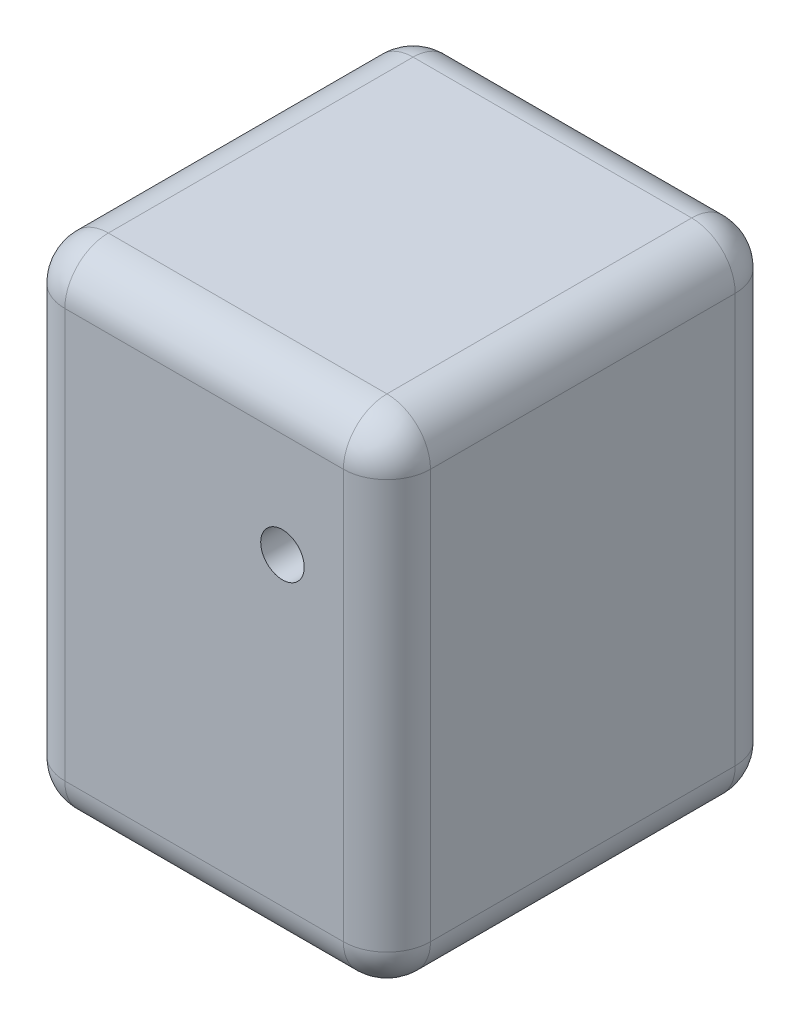
ISO-10303-21;
HEADER;
FILE_DESCRIPTION(('STEP AP214'),'2;1');
FILE_NAME('part.step','',(''),(''),'','','');
FILE_SCHEMA(('AUTOMOTIVE_DESIGN { 1 0 10303 214 1 1 1 1 }'));
ENDSEC;
DATA;
#1=APPLICATION_CONTEXT('core data for automotive mechanical design processes');
#2=APPLICATION_PROTOCOL_DEFINITION('international standard','automotive_design',2000,#1);
#3=PRODUCT_CONTEXT('',#1,'mechanical');
#4=PRODUCT('Part','Part','',(#3));
#5=PRODUCT_RELATED_PRODUCT_CATEGORY('part','',(#4));
#6=PRODUCT_DEFINITION_FORMATION('','',#4);
#7=PRODUCT_DEFINITION_CONTEXT('part definition',#1,'design');
#8=PRODUCT_DEFINITION('design','',#6,#7);
#9=PRODUCT_DEFINITION_SHAPE('','',#8);
#10=(LENGTH_UNIT() NAMED_UNIT(*) SI_UNIT(.MILLI.,.METRE.));
#11=(NAMED_UNIT(*) PLANE_ANGLE_UNIT() SI_UNIT($,.RADIAN.));
#12=(NAMED_UNIT(*) SI_UNIT($,.STERADIAN.) SOLID_ANGLE_UNIT());
#13=UNCERTAINTY_MEASURE_WITH_UNIT(LENGTH_MEASURE(1.E-05),#10,'distance_accuracy_value','');
#14=(GEOMETRIC_REPRESENTATION_CONTEXT(3) GLOBAL_UNCERTAINTY_ASSIGNED_CONTEXT((#13)) GLOBAL_UNIT_ASSIGNED_CONTEXT((#10,
#11,#12)) REPRESENTATION_CONTEXT('',''));
#15=CARTESIAN_POINT('',(0.,0.,0.));
#16=DIRECTION('',(0.,0.,1.));
#17=DIRECTION('',(1.,0.,0.));
#18=AXIS2_PLACEMENT_3D('',#15,#16,#17);
#19=CARTESIAN_POINT('',(0.,0.,45.));
#20=DIRECTION('',(0.,0.,1.));
#21=DIRECTION('',(1.,0.,0.));
#22=AXIS2_PLACEMENT_3D('',#19,#20,#21);
#23=PLANE('',#22);
#24=DIRECTION('',(-1.,0.,0.));
#25=VECTOR('',#24,1.);
#26=CARTESIAN_POINT('',(-30.,12.,45.));
#27=LINE('',#26,#25);
#28=CARTESIAN_POINT('',(7.,12.,45.));
#29=VERTEX_POINT('',#28);
#30=CARTESIAN_POINT('',(-25.,12.,45.));
#31=VERTEX_POINT('',#30);
#32=EDGE_CURVE('E204',#29,#31,#27,.T.);
#33=ORIENTED_EDGE('',*,*,#32,.T.);
#34=DIRECTION('',(0.,-1.,0.));
#35=VECTOR('',#34,1.);
#36=CARTESIAN_POINT('',(-25.,-40.,45.));
#37=LINE('',#36,#35);
#38=CARTESIAN_POINT('',(-25.,-35.,45.));
#39=VERTEX_POINT('',#38);
#40=EDGE_CURVE('E207',#31,#39,#37,.T.);
#41=ORIENTED_EDGE('',*,*,#40,.T.);
#42=DIRECTION('',(1.,0.,0.));
#43=VECTOR('',#42,1.);
#44=CARTESIAN_POINT('',(12.,-35.,45.));
#45=LINE('',#44,#43);
#46=CARTESIAN_POINT('',(7.,-35.,45.));
#47=VERTEX_POINT('',#46);
#48=EDGE_CURVE('E202',#39,#47,#45,.T.);
#49=ORIENTED_EDGE('',*,*,#48,.T.);
#50=DIRECTION('',(0.,1.,0.));
#51=VECTOR('',#50,1.);
#52=CARTESIAN_POINT('',(7.,17.,45.));
#53=LINE('',#52,#51);
#54=EDGE_CURVE('E200',#47,#29,#53,.T.);
#55=ORIENTED_EDGE('',*,*,#54,.T.);
#56=EDGE_LOOP('',(#33,#41,#49,#55));
#57=FACE_BOUND('',#56,.T.);
#58=CARTESIAN_POINT('',(0.,0.,45.));
#59=DIRECTION('',(0.,0.,1.));
#60=DIRECTION('',(1.,0.,0.));
#61=AXIS2_PLACEMENT_3D('',#58,#59,#60);
#62=CIRCLE('',#61,2.5);
#63=CARTESIAN_POINT('',(-2.5,0.,45.));
#64=VERTEX_POINT('',#63);
#65=EDGE_CURVE('E171',#64,#64,#62,.T.);
#66=ORIENTED_EDGE('',*,*,#65,.F.);
#67=EDGE_LOOP('',(#66));
#68=FACE_BOUND('',#67,.T.);
#69=ADVANCED_FACE('F44',(#57,#68),#23,.T.);
#70=CARTESIAN_POINT('',(0.,0.,0.));
#71=DIRECTION('',(0.,0.,1.));
#72=DIRECTION('',(1.,0.,0.));
#73=AXIS2_PLACEMENT_3D('',#70,#71,#72);
#74=PLANE('',#73);
#75=DIRECTION('',(0.,1.,0.));
#76=VECTOR('',#75,1.);
#77=CARTESIAN_POINT('',(7.,0.,0.));
#78=LINE('',#77,#76);
#79=CARTESIAN_POINT('',(7.,12.,0.));
#80=VERTEX_POINT('',#79);
#81=CARTESIAN_POINT('',(7.,-35.,0.));
#82=VERTEX_POINT('',#81);
#83=EDGE_CURVE('E196',#80,#82,#78,.F.);
#84=ORIENTED_EDGE('',*,*,#83,.T.);
#85=DIRECTION('',(1.,0.,0.));
#86=VECTOR('',#85,1.);
#87=CARTESIAN_POINT('',(0.,-35.,0.));
#88=LINE('',#87,#86);
#89=CARTESIAN_POINT('',(-25.,-35.,0.));
#90=VERTEX_POINT('',#89);
#91=EDGE_CURVE('E267',#82,#90,#88,.F.);
#92=ORIENTED_EDGE('',*,*,#91,.T.);
#93=DIRECTION('',(0.,-1.,0.));
#94=VECTOR('',#93,1.);
#95=CARTESIAN_POINT('',(-25.,0.,0.));
#96=LINE('',#95,#94);
#97=CARTESIAN_POINT('',(-25.,12.,0.));
#98=VERTEX_POINT('',#97);
#99=EDGE_CURVE('E198',#90,#98,#96,.F.);
#100=ORIENTED_EDGE('',*,*,#99,.T.);
#101=DIRECTION('',(-1.,0.,0.));
#102=VECTOR('',#101,1.);
#103=CARTESIAN_POINT('',(0.,12.,0.));
#104=LINE('',#103,#102);
#105=EDGE_CURVE('E194',#98,#80,#104,.F.);
#106=ORIENTED_EDGE('',*,*,#105,.T.);
#107=EDGE_LOOP('',(#84,#92,#100,#106));
#108=FACE_BOUND('',#107,.T.);
#109=CARTESIAN_POINT('',(0.,0.,0.));
#110=DIRECTION('',(0.,0.,1.));
#111=DIRECTION('',(1.,0.,0.));
#112=AXIS2_PLACEMENT_3D('',#109,#110,#111);
#113=CIRCLE('',#112,2.5);
#114=CARTESIAN_POINT('',(-2.5,0.,0.));
#115=VERTEX_POINT('',#114);
#116=EDGE_CURVE('E174',#115,#115,#113,.T.);
#117=ORIENTED_EDGE('',*,*,#116,.T.);
#118=EDGE_LOOP('',(#117));
#119=FACE_BOUND('',#118,.T.);
#120=ADVANCED_FACE('F281',(#108,#119),#74,.F.);
#121=CARTESIAN_POINT('',(-30.,17.,45.));
#122=DIRECTION('',(1.,0.,0.));
#123=DIRECTION('',(0.,0.,-1.));
#124=AXIS2_PLACEMENT_3D('',#121,#122,#123);
#125=PLANE('',#124);
#126=CARTESIAN_POINT('',(-30.,-11.5,22.5));
#127=DIRECTION('',(1.,0.,0.));
#128=DIRECTION('',(0.,0.,-1.));
#129=AXIS2_PLACEMENT_3D('',#126,#127,#128);
#130=CIRCLE('',#129,10.);
#131=CARTESIAN_POINT('',(-30.,-11.5,12.5));
#132=VERTEX_POINT('',#131);
#133=EDGE_CURVE('E52',#132,#132,#130,.F.);
#134=ORIENTED_EDGE('',*,*,#133,.F.);
#135=EDGE_LOOP('',(#134));
#136=FACE_BOUND('',#135,.T.);
#137=DIRECTION('',(0.,0.,-1.));
#138=VECTOR('',#137,1.);
#139=CARTESIAN_POINT('',(-30.,12.,45.));
#140=LINE('',#139,#138);
#141=CARTESIAN_POINT('',(-30.,12.,40.));
#142=VERTEX_POINT('',#141);
#143=CARTESIAN_POINT('',(-30.,12.,5.));
#144=VERTEX_POINT('',#143);
#145=EDGE_CURVE('E146',#142,#144,#140,.T.);
#146=ORIENTED_EDGE('',*,*,#145,.T.);
#147=DIRECTION('',(0.,-1.,0.));
#148=VECTOR('',#147,1.);
#149=CARTESIAN_POINT('',(-30.,17.,5.));
#150=LINE('',#149,#148);
#151=CARTESIAN_POINT('',(-30.,-35.,5.));
#152=VERTEX_POINT('',#151);
#153=EDGE_CURVE('E144',#144,#152,#150,.T.);
#154=ORIENTED_EDGE('',*,*,#153,.T.);
#155=DIRECTION('',(0.,0.,-1.));
#156=VECTOR('',#155,1.);
#157=CARTESIAN_POINT('',(-30.,-35.,45.));
#158=LINE('',#157,#156);
#159=CARTESIAN_POINT('',(-30.,-35.,40.));
#160=VERTEX_POINT('',#159);
#161=EDGE_CURVE('E136',#152,#160,#158,.F.);
#162=ORIENTED_EDGE('',*,*,#161,.T.);
#163=DIRECTION('',(0.,-1.,0.));
#164=VECTOR('',#163,1.);
#165=CARTESIAN_POINT('',(-30.,17.,40.));
#166=LINE('',#165,#164);
#167=EDGE_CURVE('E141',#160,#142,#166,.F.);
#168=ORIENTED_EDGE('',*,*,#167,.T.);
#169=EDGE_LOOP('',(#146,#154,#162,#168));
#170=FACE_BOUND('',#169,.T.);
#171=ADVANCED_FACE('F139',(#136,#170),#125,.F.);
#172=CARTESIAN_POINT('',(-30.,-40.,45.));
#173=DIRECTION('',(0.,1.,0.));
#174=DIRECTION('',(-1.,0.,0.));
#175=AXIS2_PLACEMENT_3D('',#172,#173,#174);
#176=PLANE('',#175);
#177=DIRECTION('',(0.,0.,-1.));
#178=VECTOR('',#177,1.);
#179=CARTESIAN_POINT('',(-25.,-40.,45.));
#180=LINE('',#179,#178);
#181=CARTESIAN_POINT('',(-25.,-40.,40.));
#182=VERTEX_POINT('',#181);
#183=CARTESIAN_POINT('',(-25.,-40.,5.));
#184=VERTEX_POINT('',#183);
#185=EDGE_CURVE('E153',#182,#184,#180,.T.);
#186=ORIENTED_EDGE('',*,*,#185,.T.);
#187=DIRECTION('',(1.,0.,0.));
#188=VECTOR('',#187,1.);
#189=CARTESIAN_POINT('',(-30.,-40.,5.));
#190=LINE('',#189,#188);
#191=CARTESIAN_POINT('',(7.00000000000001,-40.,5.));
#192=VERTEX_POINT('',#191);
#193=EDGE_CURVE('E59',#184,#192,#190,.T.);
#194=ORIENTED_EDGE('',*,*,#193,.T.);
#195=DIRECTION('',(0.,0.,-1.));
#196=VECTOR('',#195,1.);
#197=CARTESIAN_POINT('',(7.00000000000001,-40.,45.));
#198=LINE('',#197,#196);
#199=CARTESIAN_POINT('',(7.00000000000001,-40.,40.));
#200=VERTEX_POINT('',#199);
#201=EDGE_CURVE('E189',#192,#200,#198,.F.);
#202=ORIENTED_EDGE('',*,*,#201,.T.);
#203=DIRECTION('',(1.,0.,0.));
#204=VECTOR('',#203,1.);
#205=CARTESIAN_POINT('',(-30.,-40.,40.));
#206=LINE('',#205,#204);
#207=EDGE_CURVE('E191',#200,#182,#206,.F.);
#208=ORIENTED_EDGE('',*,*,#207,.T.);
#209=EDGE_LOOP('',(#186,#194,#202,#208));
#210=FACE_BOUND('',#209,.T.);
#211=ADVANCED_FACE('F280',(#210),#176,.F.);
#212=CARTESIAN_POINT('',(12.,17.,45.));
#213=DIRECTION('',(-1.,0.,0.));
#214=DIRECTION('',(0.,0.,1.));
#215=AXIS2_PLACEMENT_3D('',#212,#213,#214);
#216=PLANE('',#215);
#217=DIRECTION('',(0.,1.,0.));
#218=VECTOR('',#217,1.);
#219=CARTESIAN_POINT('',(12.,-40.,40.));
#220=LINE('',#219,#218);
#221=CARTESIAN_POINT('',(12.,12.,40.));
#222=VERTEX_POINT('',#221);
#223=CARTESIAN_POINT('',(12.,-35.,40.));
#224=VERTEX_POINT('',#223);
#225=EDGE_CURVE('E213',#222,#224,#220,.F.);
#226=ORIENTED_EDGE('',*,*,#225,.T.);
#227=DIRECTION('',(0.,0.,-1.));
#228=VECTOR('',#227,1.);
#229=CARTESIAN_POINT('',(12.,-35.,45.));
#230=LINE('',#229,#228);
#231=CARTESIAN_POINT('',(12.,-35.,5.));
#232=VERTEX_POINT('',#231);
#233=EDGE_CURVE('E215',#224,#232,#230,.T.);
#234=ORIENTED_EDGE('',*,*,#233,.T.);
#235=DIRECTION('',(0.,1.,0.));
#236=VECTOR('',#235,1.);
#237=CARTESIAN_POINT('',(12.,17.,5.));
#238=LINE('',#237,#236);
#239=CARTESIAN_POINT('',(12.,12.,5.));
#240=VERTEX_POINT('',#239);
#241=EDGE_CURVE('E209',#232,#240,#238,.T.);
#242=ORIENTED_EDGE('',*,*,#241,.T.);
#243=DIRECTION('',(0.,0.,-1.));
#244=VECTOR('',#243,1.);
#245=CARTESIAN_POINT('',(12.,12.,45.));
#246=LINE('',#245,#244);
#247=EDGE_CURVE('E211',#240,#222,#246,.F.);
#248=ORIENTED_EDGE('',*,*,#247,.T.);
#249=EDGE_LOOP('',(#226,#234,#242,#248));
#250=FACE_BOUND('',#249,.T.);
#251=ADVANCED_FACE('F288',(#250),#216,.F.);
#252=CARTESIAN_POINT('',(-30.,17.,45.));
#253=DIRECTION('',(0.,-1.,0.));
#254=DIRECTION('',(0.,0.,-1.));
#255=AXIS2_PLACEMENT_3D('',#252,#253,#254);
#256=PLANE('',#255);
#257=DIRECTION('',(-1.,0.,0.));
#258=VECTOR('',#257,1.);
#259=CARTESIAN_POINT('',(-30.,17.,5.));
#260=LINE('',#259,#258);
#261=CARTESIAN_POINT('',(7.,17.,5.));
#262=VERTEX_POINT('',#261);
#263=CARTESIAN_POINT('',(-25.,17.,5.));
#264=VERTEX_POINT('',#263);
#265=EDGE_CURVE('E180',#262,#264,#260,.T.);
#266=ORIENTED_EDGE('',*,*,#265,.T.);
#267=DIRECTION('',(0.,0.,-1.));
#268=VECTOR('',#267,1.);
#269=CARTESIAN_POINT('',(-25.,17.,45.));
#270=LINE('',#269,#268);
#271=CARTESIAN_POINT('',(-25.,17.,40.));
#272=VERTEX_POINT('',#271);
#273=EDGE_CURVE('E186',#264,#272,#270,.F.);
#274=ORIENTED_EDGE('',*,*,#273,.T.);
#275=DIRECTION('',(-1.,0.,0.));
#276=VECTOR('',#275,1.);
#277=CARTESIAN_POINT('',(12.,17.,40.));
#278=LINE('',#277,#276);
#279=CARTESIAN_POINT('',(7.,17.,40.));
#280=VERTEX_POINT('',#279);
#281=EDGE_CURVE('E184',#272,#280,#278,.F.);
#282=ORIENTED_EDGE('',*,*,#281,.T.);
#283=DIRECTION('',(0.,0.,-1.));
#284=VECTOR('',#283,1.);
#285=CARTESIAN_POINT('',(7.,17.,45.));
#286=LINE('',#285,#284);
#287=EDGE_CURVE('E182',#280,#262,#286,.T.);
#288=ORIENTED_EDGE('',*,*,#287,.T.);
#289=EDGE_LOOP('',(#266,#274,#282,#288));
#290=FACE_BOUND('',#289,.T.);
#291=ADVANCED_FACE('F306',(#290),#256,.F.);
#292=CARTESIAN_POINT('',(0.,0.,45.));
#293=DIRECTION('',(0.,0.,-1.));
#294=DIRECTION('',(-1.,0.,0.));
#295=AXIS2_PLACEMENT_3D('',#292,#293,#294);
#296=CYLINDRICAL_SURFACE('',#295,2.5);
#297=CARTESIAN_POINT('',(-2.5,0.,45.));
#298=CARTESIAN_POINT('',(-2.5,0.,44.53125));
#299=CARTESIAN_POINT('',(-2.5,0.,44.0625));
#300=CARTESIAN_POINT('',(-2.5,0.,43.125));
#301=CARTESIAN_POINT('',(-2.5,0.,42.65625));
#302=CARTESIAN_POINT('',(-2.5,0.,41.71875));
#303=CARTESIAN_POINT('',(-2.5,0.,41.25));
#304=CARTESIAN_POINT('',(-2.5,0.,40.3125));
#305=CARTESIAN_POINT('',(-2.5,0.,39.84375));
#306=CARTESIAN_POINT('',(-2.5,0.,38.90625));
#307=CARTESIAN_POINT('',(-2.5,0.,38.4375));
#308=CARTESIAN_POINT('',(-2.5,0.,37.5));
#309=CARTESIAN_POINT('',(-2.5,0.,37.03125));
#310=CARTESIAN_POINT('',(-2.5,0.,36.09375));
#311=CARTESIAN_POINT('',(-2.5,0.,35.625));
#312=CARTESIAN_POINT('',(-2.5,0.,34.6875));
#313=CARTESIAN_POINT('',(-2.5,0.,34.21875));
#314=CARTESIAN_POINT('',(-2.5,0.,33.28125));
#315=CARTESIAN_POINT('',(-2.5,0.,32.8125));
#316=CARTESIAN_POINT('',(-2.5,0.,31.875));
#317=CARTESIAN_POINT('',(-2.5,0.,31.40625));
#318=CARTESIAN_POINT('',(-2.5,0.,30.46875));
#319=CARTESIAN_POINT('',(-2.5,0.,30.));
#320=CARTESIAN_POINT('',(-2.5,0.,29.0625));
#321=CARTESIAN_POINT('',(-2.5,0.,28.59375));
#322=CARTESIAN_POINT('',(-2.5,0.,27.65625));
#323=CARTESIAN_POINT('',(-2.5,0.,27.1875));
#324=CARTESIAN_POINT('',(-2.5,0.,26.25));
#325=CARTESIAN_POINT('',(-2.5,0.,25.78125));
#326=CARTESIAN_POINT('',(-2.5,0.,24.84375));
#327=CARTESIAN_POINT('',(-2.5,0.,24.375));
#328=CARTESIAN_POINT('',(-2.5,0.,23.4375));
#329=CARTESIAN_POINT('',(-2.5,0.,22.96875));
#330=CARTESIAN_POINT('',(-2.5,0.,22.03125));
#331=CARTESIAN_POINT('',(-2.5,0.,21.5625));
#332=CARTESIAN_POINT('',(-2.5,0.,20.625));
#333=CARTESIAN_POINT('',(-2.5,0.,20.15625));
#334=CARTESIAN_POINT('',(-2.5,0.,19.21875));
#335=CARTESIAN_POINT('',(-2.5,0.,18.75));
#336=CARTESIAN_POINT('',(-2.5,0.,17.8125));
#337=CARTESIAN_POINT('',(-2.5,0.,17.34375));
#338=CARTESIAN_POINT('',(-2.5,0.,16.40625));
#339=CARTESIAN_POINT('',(-2.5,0.,15.9375));
#340=CARTESIAN_POINT('',(-2.5,0.,15.));
#341=CARTESIAN_POINT('',(-2.5,0.,14.53125));
#342=CARTESIAN_POINT('',(-2.5,0.,13.59375));
#343=CARTESIAN_POINT('',(-2.5,0.,13.125));
#344=CARTESIAN_POINT('',(-2.5,0.,12.1875));
#345=CARTESIAN_POINT('',(-2.5,0.,11.71875));
#346=CARTESIAN_POINT('',(-2.5,0.,10.78125));
#347=CARTESIAN_POINT('',(-2.5,0.,10.3125));
#348=CARTESIAN_POINT('',(-2.5,0.,9.37499999999999));
#349=CARTESIAN_POINT('',(-2.5,0.,8.90624999999999));
#350=CARTESIAN_POINT('',(-2.5,0.,7.96874999999999));
#351=CARTESIAN_POINT('',(-2.5,0.,7.5));
#352=CARTESIAN_POINT('',(-2.5,0.,6.56249999999999));
#353=CARTESIAN_POINT('',(-2.5,0.,6.09374999999999));
#354=CARTESIAN_POINT('',(-2.5,0.,5.15624999999999));
#355=CARTESIAN_POINT('',(-2.5,0.,4.68749999999999));
#356=CARTESIAN_POINT('',(-2.5,0.,3.74999999999999));
#357=CARTESIAN_POINT('',(-2.5,0.,3.28124999999999));
#358=CARTESIAN_POINT('',(-2.5,0.,2.34374999999999));
#359=CARTESIAN_POINT('',(-2.5,0.,1.87499999999999));
#360=CARTESIAN_POINT('',(-2.5,0.,0.937499999999992));
#361=CARTESIAN_POINT('',(-2.5,0.,0.468749999999993));
#362=CARTESIAN_POINT('',(-2.5,0.,0.));
#363=B_SPLINE_CURVE_WITH_KNOTS('',3,(#297,#298,#299,#300,#301,#302,#303,#304,#305,#306,#307,
#308,#309,#310,#311,#312,#313,#314,#315,#316,#317,#318,#319,#320,#321,#322,#323,#324,#325,#326,
#327,#328,#329,#330,#331,#332,#333,#334,#335,#336,#337,#338,#339,#340,#341,#342,#343,#344,#345,
#346,#347,#348,#349,#350,#351,#352,#353,#354,#355,#356,#357,#358,#359,#360,#361,#362),
.UNSPECIFIED.,.F.,.F.,(4,2,2,2,2,2,2,2,2,2,2,2,2,2,2,2,2,2,2,2,2,2,2,2,2,2,2,2,2,2,2,2,4),(0.,
1.40625,2.8125,4.21874999999999,5.625,7.03125,8.43749999999999,9.84375,11.25,12.65625,14.0625,
15.46875,16.875,18.28125,19.6875,21.09375,22.5,23.90625,25.3125,26.71875,28.125,29.53125,
30.9375,32.34375,33.75,35.15625,36.5625,37.96875,39.375,40.78125,42.1875,43.59375,45.),.UNSPECIFIED.);
#364=EDGE_CURVE('BSEAM303',#64,#115,#363,.T.);
#365=ORIENTED_EDGE('',*,*,#65,.T.);
#366=ORIENTED_EDGE('',*,*,#116,.F.);
#367=ORIENTED_EDGE('',*,*,#364,.T.);
#368=ORIENTED_EDGE('',*,*,#364,.F.);
#369=EDGE_LOOP('',(#365,#367,#366,#368));
#370=FACE_BOUND('',#369,.T.);
#371=ADVANCED_FACE('F303',(#370),#296,.F.);
#372=CARTESIAN_POINT('',(7.,-35.,40.));
#373=DIRECTION('',(0.,0.,1.));
#374=DIRECTION('',(1.,0.,0.));
#375=AXIS2_PLACEMENT_3D('',#372,#373,#374);
#376=SPHERICAL_SURFACE('',#375,5.);
#377=CARTESIAN_POINT('',(7.,-35.,40.));
#378=DIRECTION('',(1.,0.,0.));
#379=DIRECTION('',(0.,1.,0.));
#380=AXIS2_PLACEMENT_3D('',#377,#378,#379);
#381=CIRCLE('',#380,5.);
#382=EDGE_CURVE('E250',#200,#47,#381,.F.);
#383=ORIENTED_EDGE('',*,*,#382,.F.);
#384=CARTESIAN_POINT('',(7.,-35.,40.));
#385=DIRECTION('',(0.,0.,1.));
#386=DIRECTION('',(1.,0.,0.));
#387=AXIS2_PLACEMENT_3D('',#384,#385,#386);
#388=CIRCLE('',#387,5.);
#389=EDGE_CURVE('E256',#224,#200,#388,.F.);
#390=ORIENTED_EDGE('',*,*,#389,.F.);
#391=CARTESIAN_POINT('',(7.,-35.,40.));
#392=DIRECTION('',(0.,-1.,0.));
#393=DIRECTION('',(0.,0.,-1.));
#394=AXIS2_PLACEMENT_3D('',#391,#392,#393);
#395=CIRCLE('',#394,5.);
#396=EDGE_CURVE('E253',#47,#224,#395,.F.);
#397=ORIENTED_EDGE('',*,*,#396,.F.);
#398=EDGE_LOOP('',(#383,#390,#397));
#399=FACE_BOUND('',#398,.T.);
#400=ADVANCED_FACE('F326',(#399),#376,.T.);
#401=CARTESIAN_POINT('',(7.,-35.,45.));
#402=DIRECTION('',(0.,0.,-1.));
#403=DIRECTION('',(-1.,0.,0.));
#404=AXIS2_PLACEMENT_3D('',#401,#402,#403);
#405=CYLINDRICAL_SURFACE('',#404,5.);
#406=ORIENTED_EDGE('',*,*,#201,.F.);
#407=CARTESIAN_POINT('',(7.,-35.,5.));
#408=DIRECTION('',(0.,0.,-1.));
#409=DIRECTION('',(-1.,0.,0.));
#410=AXIS2_PLACEMENT_3D('',#407,#408,#409);
#411=CIRCLE('',#410,5.);
#412=EDGE_CURVE('E264',#192,#232,#411,.F.);
#413=ORIENTED_EDGE('',*,*,#412,.T.);
#414=ORIENTED_EDGE('',*,*,#233,.F.);
#415=ORIENTED_EDGE('',*,*,#389,.T.);
#416=EDGE_LOOP('',(#406,#413,#414,#415));
#417=FACE_BOUND('',#416,.T.);
#418=ADVANCED_FACE('F329',(#417),#405,.T.);
#419=CARTESIAN_POINT('',(7.,0.,40.));
#420=DIRECTION('',(0.,-1.,0.));
#421=DIRECTION('',(0.,0.,-1.));
#422=AXIS2_PLACEMENT_3D('',#419,#420,#421);
#423=CYLINDRICAL_SURFACE('',#422,5.);
#424=ORIENTED_EDGE('',*,*,#396,.T.);
#425=ORIENTED_EDGE('',*,*,#225,.F.);
#426=CARTESIAN_POINT('',(7.,12.,40.));
#427=DIRECTION('',(0.,1.,0.));
#428=DIRECTION('',(0.,0.,1.));
#429=AXIS2_PLACEMENT_3D('',#426,#427,#428);
#430=CIRCLE('',#429,5.);
#431=EDGE_CURVE('E244',#29,#222,#430,.T.);
#432=ORIENTED_EDGE('',*,*,#431,.F.);
#433=ORIENTED_EDGE('',*,*,#54,.F.);
#434=EDGE_LOOP('',(#424,#425,#432,#433));
#435=FACE_BOUND('',#434,.T.);
#436=ADVANCED_FACE('F323',(#435),#423,.T.);
#437=CARTESIAN_POINT('',(0.,-35.,40.));
#438=DIRECTION('',(-1.,0.,0.));
#439=DIRECTION('',(0.,-1.,0.));
#440=AXIS2_PLACEMENT_3D('',#437,#438,#439);
#441=CYLINDRICAL_SURFACE('',#440,5.);
#442=ORIENTED_EDGE('',*,*,#382,.T.);
#443=ORIENTED_EDGE('',*,*,#48,.F.);
#444=CARTESIAN_POINT('',(-25.,-35.,40.));
#445=DIRECTION('',(-1.,0.,0.));
#446=DIRECTION('',(0.,0.,1.));
#447=AXIS2_PLACEMENT_3D('',#444,#445,#446);
#448=CIRCLE('',#447,5.);
#449=EDGE_CURVE('E156',#182,#39,#448,.T.);
#450=ORIENTED_EDGE('',*,*,#449,.F.);
#451=ORIENTED_EDGE('',*,*,#207,.F.);
#452=EDGE_LOOP('',(#442,#443,#450,#451));
#453=FACE_BOUND('',#452,.T.);
#454=ADVANCED_FACE('F350',(#453),#441,.T.);
#455=CARTESIAN_POINT('',(7.,17.,5.));
#456=DIRECTION('',(0.,1.,0.));
#457=DIRECTION('',(0.,0.,1.));
#458=AXIS2_PLACEMENT_3D('',#455,#456,#457);
#459=CYLINDRICAL_SURFACE('',#458,5.);
#460=ORIENTED_EDGE('',*,*,#241,.F.);
#461=CARTESIAN_POINT('',(7.,-35.,5.));
#462=DIRECTION('',(0.,1.,0.));
#463=DIRECTION('',(0.,0.,1.));
#464=AXIS2_PLACEMENT_3D('',#461,#462,#463);
#465=CIRCLE('',#464,5.);
#466=EDGE_CURVE('E67',#232,#82,#465,.T.);
#467=ORIENTED_EDGE('',*,*,#466,.T.);
#468=ORIENTED_EDGE('',*,*,#83,.F.);
#469=CARTESIAN_POINT('',(7.,12.,5.));
#470=DIRECTION('',(0.,1.,0.));
#471=DIRECTION('',(0.,0.,1.));
#472=AXIS2_PLACEMENT_3D('',#469,#470,#471);
#473=CIRCLE('',#472,5.);
#474=EDGE_CURVE('E157',#240,#80,#473,.T.);
#475=ORIENTED_EDGE('',*,*,#474,.F.);
#476=EDGE_LOOP('',(#460,#467,#468,#475));
#477=FACE_BOUND('',#476,.T.);
#478=ADVANCED_FACE('F334',(#477),#459,.T.);
#479=CARTESIAN_POINT('',(7.,12.,45.));
#480=DIRECTION('',(0.,0.,-1.));
#481=DIRECTION('',(-1.,0.,0.));
#482=AXIS2_PLACEMENT_3D('',#479,#480,#481);
#483=CYLINDRICAL_SURFACE('',#482,5.);
#484=CARTESIAN_POINT('',(7.,12.,40.));
#485=DIRECTION('',(0.,0.,1.));
#486=DIRECTION('',(1.,0.,0.));
#487=AXIS2_PLACEMENT_3D('',#484,#485,#486);
#488=CIRCLE('',#487,5.);
#489=EDGE_CURVE('E247',#222,#280,#488,.T.);
#490=ORIENTED_EDGE('',*,*,#489,.F.);
#491=ORIENTED_EDGE('',*,*,#247,.F.);
#492=CARTESIAN_POINT('',(7.,12.,5.));
#493=DIRECTION('',(0.,0.,-1.));
#494=DIRECTION('',(-1.,0.,0.));
#495=AXIS2_PLACEMENT_3D('',#492,#493,#494);
#496=CIRCLE('',#495,5.);
#497=EDGE_CURVE('E238',#262,#240,#496,.T.);
#498=ORIENTED_EDGE('',*,*,#497,.F.);
#499=ORIENTED_EDGE('',*,*,#287,.F.);
#500=EDGE_LOOP('',(#490,#491,#498,#499));
#501=FACE_BOUND('',#500,.T.);
#502=ADVANCED_FACE('F337',(#501),#483,.T.);
#503=CARTESIAN_POINT('',(7.,12.,40.));
#504=DIRECTION('',(0.,0.,1.));
#505=DIRECTION('',(1.,0.,0.));
#506=AXIS2_PLACEMENT_3D('',#503,#504,#505);
#507=SPHERICAL_SURFACE('',#506,5.);
#508=ORIENTED_EDGE('',*,*,#431,.T.);
#509=ORIENTED_EDGE('',*,*,#489,.T.);
#510=CARTESIAN_POINT('',(7.,12.,40.));
#511=DIRECTION('',(1.,0.,0.));
#512=DIRECTION('',(0.,0.,-1.));
#513=AXIS2_PLACEMENT_3D('',#510,#511,#512);
#514=CIRCLE('',#513,5.);
#515=EDGE_CURVE('E165',#29,#280,#514,.F.);
#516=ORIENTED_EDGE('',*,*,#515,.F.);
#517=EDGE_LOOP('',(#508,#509,#516));
#518=FACE_BOUND('',#517,.T.);
#519=ADVANCED_FACE('F342',(#518),#507,.T.);
#520=CARTESIAN_POINT('',(-25.,-35.,40.));
#521=DIRECTION('',(0.,0.,1.));
#522=DIRECTION('',(1.,0.,0.));
#523=AXIS2_PLACEMENT_3D('',#520,#521,#522);
#524=SPHERICAL_SURFACE('',#523,5.);
#525=CARTESIAN_POINT('',(-25.,-35.,40.));
#526=DIRECTION('',(0.,-1.,0.));
#527=DIRECTION('',(0.,0.,-1.));
#528=AXIS2_PLACEMENT_3D('',#525,#526,#527);
#529=CIRCLE('',#528,5.);
#530=EDGE_CURVE('E160',#160,#39,#529,.F.);
#531=ORIENTED_EDGE('',*,*,#530,.F.);
#532=CARTESIAN_POINT('',(-25.,-35.,40.));
#533=DIRECTION('',(0.,0.,1.));
#534=DIRECTION('',(1.,0.,0.));
#535=AXIS2_PLACEMENT_3D('',#532,#533,#534);
#536=CIRCLE('',#535,5.);
#537=EDGE_CURVE('E150',#182,#160,#536,.F.);
#538=ORIENTED_EDGE('',*,*,#537,.F.);
#539=ORIENTED_EDGE('',*,*,#449,.T.);
#540=EDGE_LOOP('',(#531,#538,#539));
#541=FACE_BOUND('',#540,.T.);
#542=ADVANCED_FACE('F161',(#541),#524,.T.);
#543=CARTESIAN_POINT('',(-25.,-35.,45.));
#544=DIRECTION('',(0.,0.,-1.));
#545=DIRECTION('',(-1.,0.,0.));
#546=AXIS2_PLACEMENT_3D('',#543,#544,#545);
#547=CYLINDRICAL_SURFACE('',#546,5.);
#548=ORIENTED_EDGE('',*,*,#161,.F.);
#549=CARTESIAN_POINT('',(-25.,-35.,5.));
#550=DIRECTION('',(0.,0.,-1.));
#551=DIRECTION('',(-1.,0.,0.));
#552=AXIS2_PLACEMENT_3D('',#549,#550,#551);
#553=CIRCLE('',#552,5.);
#554=EDGE_CURVE('E261',#152,#184,#553,.F.);
#555=ORIENTED_EDGE('',*,*,#554,.T.);
#556=ORIENTED_EDGE('',*,*,#185,.F.);
#557=ORIENTED_EDGE('',*,*,#537,.T.);
#558=EDGE_LOOP('',(#548,#555,#556,#557));
#559=FACE_BOUND('',#558,.T.);
#560=ADVANCED_FACE('F152',(#559),#547,.T.);
#561=CARTESIAN_POINT('',(7.,12.,5.));
#562=DIRECTION('',(0.,0.,1.));
#563=DIRECTION('',(1.,0.,0.));
#564=AXIS2_PLACEMENT_3D('',#561,#562,#563);
#565=SPHERICAL_SURFACE('',#564,5.);
#566=ORIENTED_EDGE('',*,*,#497,.T.);
#567=ORIENTED_EDGE('',*,*,#474,.T.);
#568=CARTESIAN_POINT('',(7.,12.,5.));
#569=DIRECTION('',(1.,0.,0.));
#570=DIRECTION('',(0.,1.,0.));
#571=AXIS2_PLACEMENT_3D('',#568,#569,#570);
#572=CIRCLE('',#571,5.);
#573=EDGE_CURVE('E166',#262,#80,#572,.F.);
#574=ORIENTED_EDGE('',*,*,#573,.F.);
#575=EDGE_LOOP('',(#566,#567,#574));
#576=FACE_BOUND('',#575,.T.);
#577=ADVANCED_FACE('F370',(#576),#565,.T.);
#578=CARTESIAN_POINT('',(0.,12.,40.));
#579=DIRECTION('',(1.,0.,0.));
#580=DIRECTION('',(0.,0.,-1.));
#581=AXIS2_PLACEMENT_3D('',#578,#579,#580);
#582=CYLINDRICAL_SURFACE('',#581,5.);
#583=ORIENTED_EDGE('',*,*,#515,.T.);
#584=ORIENTED_EDGE('',*,*,#281,.F.);
#585=CARTESIAN_POINT('',(-25.,12.,40.));
#586=DIRECTION('',(-1.,0.,0.));
#587=DIRECTION('',(0.,0.,1.));
#588=AXIS2_PLACEMENT_3D('',#585,#586,#587);
#589=CIRCLE('',#588,5.);
#590=EDGE_CURVE('E231',#31,#272,#589,.T.);
#591=ORIENTED_EDGE('',*,*,#590,.F.);
#592=ORIENTED_EDGE('',*,*,#32,.F.);
#593=EDGE_LOOP('',(#583,#584,#591,#592));
#594=FACE_BOUND('',#593,.T.);
#595=ADVANCED_FACE('F347',(#594),#582,.T.);
#596=CARTESIAN_POINT('',(-25.,0.,40.));
#597=DIRECTION('',(0.,1.,0.));
#598=DIRECTION('',(0.,0.,1.));
#599=AXIS2_PLACEMENT_3D('',#596,#597,#598);
#600=CYLINDRICAL_SURFACE('',#599,5.);
#601=ORIENTED_EDGE('',*,*,#530,.T.);
#602=ORIENTED_EDGE('',*,*,#40,.F.);
#603=CARTESIAN_POINT('',(-25.,12.,40.));
#604=DIRECTION('',(0.,1.,0.));
#605=DIRECTION('',(0.,0.,1.));
#606=AXIS2_PLACEMENT_3D('',#603,#604,#605);
#607=CIRCLE('',#606,5.);
#608=EDGE_CURVE('E169',#142,#31,#607,.T.);
#609=ORIENTED_EDGE('',*,*,#608,.F.);
#610=ORIENTED_EDGE('',*,*,#167,.F.);
#611=EDGE_LOOP('',(#601,#602,#609,#610));
#612=FACE_BOUND('',#611,.T.);
#613=ADVANCED_FACE('F168',(#612),#600,.T.);
#614=CARTESIAN_POINT('',(-25.,17.,5.));
#615=DIRECTION('',(0.,-1.,0.));
#616=DIRECTION('',(0.,0.,-1.));
#617=AXIS2_PLACEMENT_3D('',#614,#615,#616);
#618=CYLINDRICAL_SURFACE('',#617,5.);
#619=ORIENTED_EDGE('',*,*,#99,.F.);
#620=CARTESIAN_POINT('',(-25.,-35.,5.));
#621=DIRECTION('',(0.,-1.,0.));
#622=DIRECTION('',(0.,0.,-1.));
#623=AXIS2_PLACEMENT_3D('',#620,#621,#622);
#624=CIRCLE('',#623,5.);
#625=EDGE_CURVE('E218',#90,#152,#624,.F.);
#626=ORIENTED_EDGE('',*,*,#625,.T.);
#627=ORIENTED_EDGE('',*,*,#153,.F.);
#628=CARTESIAN_POINT('',(-25.,12.,5.));
#629=DIRECTION('',(0.,1.,0.));
#630=DIRECTION('',(-1.,0.,0.));
#631=AXIS2_PLACEMENT_3D('',#628,#629,#630);
#632=CIRCLE('',#631,5.);
#633=EDGE_CURVE('E227',#98,#144,#632,.T.);
#634=ORIENTED_EDGE('',*,*,#633,.F.);
#635=EDGE_LOOP('',(#619,#626,#627,#634));
#636=FACE_BOUND('',#635,.T.);
#637=ADVANCED_FACE('F360',(#636),#618,.T.);
#638=CARTESIAN_POINT('',(-30.,12.,5.));
#639=DIRECTION('',(-1.,0.,0.));
#640=DIRECTION('',(0.,0.,1.));
#641=AXIS2_PLACEMENT_3D('',#638,#639,#640);
#642=CYLINDRICAL_SURFACE('',#641,5.);
#643=ORIENTED_EDGE('',*,*,#573,.T.);
#644=ORIENTED_EDGE('',*,*,#105,.F.);
#645=CARTESIAN_POINT('',(-25.,12.,5.));
#646=DIRECTION('',(-1.,0.,0.));
#647=DIRECTION('',(0.,0.,1.));
#648=AXIS2_PLACEMENT_3D('',#645,#646,#647);
#649=CIRCLE('',#648,5.);
#650=EDGE_CURVE('E224',#264,#98,#649,.T.);
#651=ORIENTED_EDGE('',*,*,#650,.F.);
#652=ORIENTED_EDGE('',*,*,#265,.F.);
#653=EDGE_LOOP('',(#643,#644,#651,#652));
#654=FACE_BOUND('',#653,.T.);
#655=ADVANCED_FACE('F366',(#654),#642,.T.);
#656=CARTESIAN_POINT('',(-25.,12.,40.));
#657=DIRECTION('',(0.,0.,1.));
#658=DIRECTION('',(1.,0.,0.));
#659=AXIS2_PLACEMENT_3D('',#656,#657,#658);
#660=SPHERICAL_SURFACE('',#659,5.);
#661=ORIENTED_EDGE('',*,*,#608,.T.);
#662=ORIENTED_EDGE('',*,*,#590,.T.);
#663=CARTESIAN_POINT('',(-25.,12.,40.));
#664=DIRECTION('',(0.,0.,1.));
#665=DIRECTION('',(1.,0.,0.));
#666=AXIS2_PLACEMENT_3D('',#663,#664,#665);
#667=CIRCLE('',#666,5.);
#668=EDGE_CURVE('E221',#142,#272,#667,.F.);
#669=ORIENTED_EDGE('',*,*,#668,.F.);
#670=EDGE_LOOP('',(#661,#662,#669));
#671=FACE_BOUND('',#670,.T.);
#672=ADVANCED_FACE('F412',(#671),#660,.T.);
#673=CARTESIAN_POINT('',(-25.,12.,5.));
#674=DIRECTION('',(0.,0.,1.));
#675=DIRECTION('',(1.,0.,0.));
#676=AXIS2_PLACEMENT_3D('',#673,#674,#675);
#677=SPHERICAL_SURFACE('',#676,5.);
#678=ORIENTED_EDGE('',*,*,#650,.T.);
#679=ORIENTED_EDGE('',*,*,#633,.T.);
#680=CARTESIAN_POINT('',(-25.,12.,5.));
#681=DIRECTION('',(0.,0.,-1.));
#682=DIRECTION('',(-1.,0.,0.));
#683=AXIS2_PLACEMENT_3D('',#680,#681,#682);
#684=CIRCLE('',#683,5.);
#685=EDGE_CURVE('E219',#264,#144,#684,.F.);
#686=ORIENTED_EDGE('',*,*,#685,.F.);
#687=EDGE_LOOP('',(#678,#679,#686));
#688=FACE_BOUND('',#687,.T.);
#689=ADVANCED_FACE('F407',(#688),#677,.T.);
#690=CARTESIAN_POINT('',(-25.,12.,45.));
#691=DIRECTION('',(0.,0.,-1.));
#692=DIRECTION('',(-1.,0.,0.));
#693=AXIS2_PLACEMENT_3D('',#690,#691,#692);
#694=CYLINDRICAL_SURFACE('',#693,5.);
#695=ORIENTED_EDGE('',*,*,#668,.T.);
#696=ORIENTED_EDGE('',*,*,#273,.F.);
#697=ORIENTED_EDGE('',*,*,#685,.T.);
#698=ORIENTED_EDGE('',*,*,#145,.F.);
#699=EDGE_LOOP('',(#695,#696,#697,#698));
#700=FACE_BOUND('',#699,.T.);
#701=ADVANCED_FACE('F403',(#700),#694,.T.);
#702=CARTESIAN_POINT('',(7.,-35.,5.));
#703=DIRECTION('',(0.,0.,1.));
#704=DIRECTION('',(1.,0.,0.));
#705=AXIS2_PLACEMENT_3D('',#702,#703,#704);
#706=SPHERICAL_SURFACE('',#705,5.);
#707=ORIENTED_EDGE('',*,*,#466,.F.);
#708=ORIENTED_EDGE('',*,*,#412,.F.);
#709=CARTESIAN_POINT('',(7.,-35.,5.));
#710=DIRECTION('',(-1.,0.,0.));
#711=DIRECTION('',(0.,-1.,0.));
#712=AXIS2_PLACEMENT_3D('',#709,#710,#711);
#713=CIRCLE('',#712,5.);
#714=EDGE_CURVE('E222',#82,#192,#713,.T.);
#715=ORIENTED_EDGE('',*,*,#714,.F.);
#716=EDGE_LOOP('',(#707,#708,#715));
#717=FACE_BOUND('',#716,.T.);
#718=ADVANCED_FACE('F401',(#717),#706,.T.);
#719=CARTESIAN_POINT('',(-30.,-35.,5.));
#720=DIRECTION('',(1.,0.,0.));
#721=DIRECTION('',(0.,1.,0.));
#722=AXIS2_PLACEMENT_3D('',#719,#720,#721);
#723=CYLINDRICAL_SURFACE('',#722,5.);
#724=ORIENTED_EDGE('',*,*,#714,.T.);
#725=ORIENTED_EDGE('',*,*,#193,.F.);
#726=CARTESIAN_POINT('',(-25.,-35.,5.));
#727=DIRECTION('',(-1.,0.,0.));
#728=DIRECTION('',(0.,0.,1.));
#729=AXIS2_PLACEMENT_3D('',#726,#727,#728);
#730=CIRCLE('',#729,5.);
#731=EDGE_CURVE('E269',#90,#184,#730,.T.);
#732=ORIENTED_EDGE('',*,*,#731,.F.);
#733=ORIENTED_EDGE('',*,*,#91,.F.);
#734=EDGE_LOOP('',(#724,#725,#732,#733));
#735=FACE_BOUND('',#734,.T.);
#736=ADVANCED_FACE('F353',(#735),#723,.T.);
#737=CARTESIAN_POINT('',(-25.,-35.,5.));
#738=DIRECTION('',(0.,0.,1.));
#739=DIRECTION('',(1.,0.,0.));
#740=AXIS2_PLACEMENT_3D('',#737,#738,#739);
#741=SPHERICAL_SURFACE('',#740,5.);
#742=ORIENTED_EDGE('',*,*,#731,.T.);
#743=ORIENTED_EDGE('',*,*,#554,.F.);
#744=ORIENTED_EDGE('',*,*,#625,.F.);
#745=EDGE_LOOP('',(#742,#743,#744));
#746=FACE_BOUND('',#745,.T.);
#747=ADVANCED_FACE('F357',(#746),#741,.T.);
#748=CARTESIAN_POINT('',(-31.,-11.5,22.5));
#749=DIRECTION('',(-1.,0.,0.));
#750=DIRECTION('',(0.,0.,1.));
#751=AXIS2_PLACEMENT_3D('',#748,#749,#750);
#752=PLANE('',#751);
#753=CARTESIAN_POINT('',(-31.,-11.5,22.5));
#754=DIRECTION('',(-1.,0.,0.));
#755=DIRECTION('',(0.,0.,1.));
#756=AXIS2_PLACEMENT_3D('',#753,#754,#755);
#757=CIRCLE('',#756,9.);
#758=CARTESIAN_POINT('',(-31.,-11.5,31.5));
#759=VERTEX_POINT('',#758);
#760=EDGE_CURVE('E11',#759,#759,#757,.T.);
#761=ORIENTED_EDGE('',*,*,#760,.T.);
#762=EDGE_LOOP('',(#761));
#763=FACE_BOUND('',#762,.T.);
#764=CARTESIAN_POINT('',(-31.,-11.5,22.5));
#765=DIRECTION('',(-1.,0.,0.));
#766=DIRECTION('',(0.,0.,1.));
#767=AXIS2_PLACEMENT_3D('',#764,#765,#766);
#768=CIRCLE('',#767,2.5);
#769=CARTESIAN_POINT('',(-31.,-11.5,25.));
#770=VERTEX_POINT('',#769);
#771=EDGE_CURVE('E272',#770,#770,#768,.T.);
#772=ORIENTED_EDGE('',*,*,#771,.F.);
#773=EDGE_LOOP('',(#772));
#774=FACE_BOUND('',#773,.T.);
#775=ADVANCED_FACE('F399',(#763,#774),#752,.T.);
#776=CARTESIAN_POINT('',(-31.,-11.5,22.5));
#777=DIRECTION('',(1.,0.,0.));
#778=DIRECTION('',(0.,0.,-1.));
#779=AXIS2_PLACEMENT_3D('',#776,#777,#778);
#780=CYLINDRICAL_SURFACE('',#779,2.5);
#781=ORIENTED_EDGE('',*,*,#771,.T.);
#782=EDGE_LOOP('',(#781));
#783=FACE_BOUND('',#782,.T.);
#784=CARTESIAN_POINT('',(-30.,-11.5,22.5));
#785=DIRECTION('',(-1.,0.,0.));
#786=DIRECTION('',(0.,0.,1.));
#787=AXIS2_PLACEMENT_3D('',#784,#785,#786);
#788=CIRCLE('',#787,2.5);
#789=CARTESIAN_POINT('',(-30.,-11.5,25.));
#790=VERTEX_POINT('',#789);
#791=EDGE_CURVE('E680',#790,#790,#788,.T.);
#792=ORIENTED_EDGE('',*,*,#791,.F.);
#793=EDGE_LOOP('',(#792));
#794=FACE_BOUND('',#793,.T.);
#795=ADVANCED_FACE('F294',(#783,#794),#780,.F.);
#796=ORIENTED_EDGE('',*,*,#791,.T.);
#797=EDGE_LOOP('',(#796));
#798=FACE_BOUND('',#797,.T.);
#799=ADVANCED_FACE('F283',(#798),#125,.F.);
#800=CARTESIAN_POINT('',(-30.,-11.5,22.5));
#801=DIRECTION('',(-1.,0.,0.));
#802=DIRECTION('',(0.,0.,1.));
#803=AXIS2_PLACEMENT_3D('',#800,#801,#802);
#804=TOROIDAL_SURFACE('',#803,9.,1.);
#805=ORIENTED_EDGE('',*,*,#133,.T.);
#806=EDGE_LOOP('',(#805));
#807=FACE_BOUND('',#806,.T.);
#808=ORIENTED_EDGE('',*,*,#760,.F.);
#809=EDGE_LOOP('',(#808));
#810=FACE_BOUND('',#809,.T.);
#811=ADVANCED_FACE('F46',(#807,#810),#804,.T.);
#812=CLOSED_SHELL('',(#69,#120,#171,#211,#251,#291,#371,#400,#418,#436,#454,#478,#502,#519,#542,
#560,#577,#595,#613,#637,#655,#672,#689,#701,#718,#736,#747,#775,#795,#799,#811));
#813=MANIFOLD_SOLID_BREP('B2',#812);
#814=ADVANCED_BREP_SHAPE_REPRESENTATION('',(#18,#813),#14);
#815=SHAPE_DEFINITION_REPRESENTATION(#9,#814);
ENDSEC;
END-ISO-10303-21;
